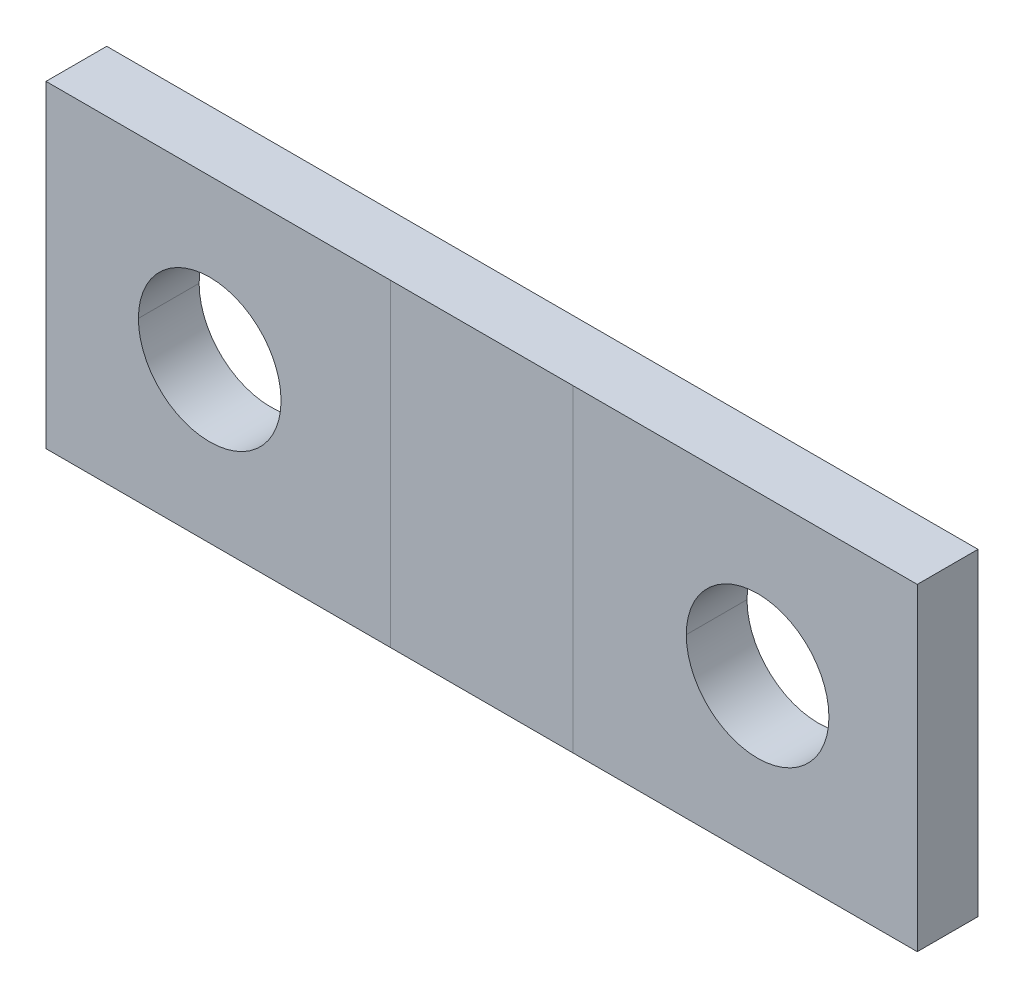
ISO-10303-21;
HEADER;
FILE_DESCRIPTION(('STEP AP214'),'2;1');
FILE_NAME('part.step','',(''),(''),'','','');
FILE_SCHEMA(('AUTOMOTIVE_DESIGN { 1 0 10303 214 1 1 1 1 }'));
ENDSEC;
DATA;
#1=APPLICATION_CONTEXT('core data for automotive mechanical design processes');
#2=APPLICATION_PROTOCOL_DEFINITION('international standard','automotive_design',2000,#1);
#3=PRODUCT_CONTEXT('',#1,'mechanical');
#4=PRODUCT('Part','Part','',(#3));
#5=PRODUCT_RELATED_PRODUCT_CATEGORY('part','',(#4));
#6=PRODUCT_DEFINITION_FORMATION('','',#4);
#7=PRODUCT_DEFINITION_CONTEXT('part definition',#1,'design');
#8=PRODUCT_DEFINITION('design','',#6,#7);
#9=PRODUCT_DEFINITION_SHAPE('','',#8);
#10=(LENGTH_UNIT() NAMED_UNIT(*) SI_UNIT(.MILLI.,.METRE.));
#11=(NAMED_UNIT(*) PLANE_ANGLE_UNIT() SI_UNIT($,.RADIAN.));
#12=(NAMED_UNIT(*) SI_UNIT($,.STERADIAN.) SOLID_ANGLE_UNIT());
#13=UNCERTAINTY_MEASURE_WITH_UNIT(LENGTH_MEASURE(1.E-05),#10,'distance_accuracy_value','');
#14=(GEOMETRIC_REPRESENTATION_CONTEXT(3) GLOBAL_UNCERTAINTY_ASSIGNED_CONTEXT((#13)) GLOBAL_UNIT_ASSIGNED_CONTEXT((#10,
#11,#12)) REPRESENTATION_CONTEXT('',''));
#15=CARTESIAN_POINT('',(0.,0.,0.));
#16=DIRECTION('',(0.,0.,1.));
#17=DIRECTION('',(1.,0.,0.));
#18=AXIS2_PLACEMENT_3D('',#15,#16,#17);
#19=CARTESIAN_POINT('',(-6.71,3.925,0.7486));
#20=DIRECTION('',(0.,0.,1.));
#21=DIRECTION('',(1.,0.,0.));
#22=AXIS2_PLACEMENT_3D('',#19,#20,#21);
#23=CYLINDRICAL_SURFACE('',#22,1.76);
#24=CARTESIAN_POINT('',(-6.71,3.925,-0.75));
#25=DIRECTION('',(0.,0.,1.));
#26=DIRECTION('',(1.,0.,0.));
#27=AXIS2_PLACEMENT_3D('',#24,#25,#26);
#28=CIRCLE('',#27,1.76);
#29=CARTESIAN_POINT('',(-8.47,3.925,-0.75));
#30=VERTEX_POINT('',#29);
#31=CARTESIAN_POINT('',(-4.95,3.925,-0.75));
#32=VERTEX_POINT('',#31);
#33=EDGE_CURVE('E42',#30,#32,#28,.T.);
#34=ORIENTED_EDGE('',*,*,#33,.F.);
#35=DIRECTION('',(0.,0.,1.));
#36=VECTOR('',#35,1.);
#37=CARTESIAN_POINT('',(-8.47,3.925,0.7486));
#38=LINE('',#37,#36);
#39=CARTESIAN_POINT('',(-8.47,3.925,0.7486));
#40=VERTEX_POINT('',#39);
#41=EDGE_CURVE('E11',#30,#40,#38,.T.);
#42=ORIENTED_EDGE('',*,*,#41,.T.);
#43=CARTESIAN_POINT('',(-6.71,3.925,0.7486));
#44=DIRECTION('',(0.,0.,1.));
#45=DIRECTION('',(1.,0.,0.));
#46=AXIS2_PLACEMENT_3D('',#43,#44,#45);
#47=CIRCLE('',#46,1.76);
#48=CARTESIAN_POINT('',(-4.95,3.925,0.7486));
#49=VERTEX_POINT('',#48);
#50=EDGE_CURVE('E28',#40,#49,#47,.T.);
#51=ORIENTED_EDGE('',*,*,#50,.T.);
#52=DIRECTION('',(0.,0.,1.));
#53=VECTOR('',#52,1.);
#54=CARTESIAN_POINT('',(-4.95,3.925,0.7486));
#55=LINE('',#54,#53);
#56=EDGE_CURVE('E115',#32,#49,#55,.T.);
#57=ORIENTED_EDGE('',*,*,#56,.F.);
#58=EDGE_LOOP('',(#34,#42,#51,#57));
#59=FACE_BOUND('',#58,.T.);
#60=ADVANCED_FACE('F17',(#59),#23,.F.);
#61=CARTESIAN_POINT('',(6.81,3.925,0.7486));
#62=DIRECTION('',(0.,0.,1.));
#63=DIRECTION('',(1.,0.,0.));
#64=AXIS2_PLACEMENT_3D('',#61,#62,#63);
#65=CYLINDRICAL_SURFACE('',#64,1.76);
#66=CARTESIAN_POINT('',(6.81,3.925,-0.75));
#67=DIRECTION('',(0.,0.,1.));
#68=DIRECTION('',(1.,0.,0.));
#69=AXIS2_PLACEMENT_3D('',#66,#67,#68);
#70=CIRCLE('',#69,1.76);
#71=CARTESIAN_POINT('',(5.05,3.925,-0.75));
#72=VERTEX_POINT('',#71);
#73=CARTESIAN_POINT('',(8.57,3.925,-0.75));
#74=VERTEX_POINT('',#73);
#75=EDGE_CURVE('E144',#72,#74,#70,.T.);
#76=ORIENTED_EDGE('',*,*,#75,.F.);
#77=DIRECTION('',(0.,0.,1.));
#78=VECTOR('',#77,1.);
#79=CARTESIAN_POINT('',(5.05,3.925,0.7486));
#80=LINE('',#79,#78);
#81=CARTESIAN_POINT('',(5.05,3.925,0.7486));
#82=VERTEX_POINT('',#81);
#83=EDGE_CURVE('E139',#72,#82,#80,.T.);
#84=ORIENTED_EDGE('',*,*,#83,.T.);
#85=CARTESIAN_POINT('',(6.81,3.925,0.7486));
#86=DIRECTION('',(0.,0.,1.));
#87=DIRECTION('',(1.,0.,0.));
#88=AXIS2_PLACEMENT_3D('',#85,#86,#87);
#89=CIRCLE('',#88,1.76);
#90=CARTESIAN_POINT('',(8.57,3.925,0.7486));
#91=VERTEX_POINT('',#90);
#92=EDGE_CURVE('E133',#82,#91,#89,.T.);
#93=ORIENTED_EDGE('',*,*,#92,.T.);
#94=DIRECTION('',(0.,0.,1.));
#95=VECTOR('',#94,1.);
#96=CARTESIAN_POINT('',(8.57,3.925,0.7486));
#97=LINE('',#96,#95);
#98=EDGE_CURVE('E97',#74,#91,#97,.T.);
#99=ORIENTED_EDGE('',*,*,#98,.F.);
#100=EDGE_LOOP('',(#76,#84,#93,#99));
#101=FACE_BOUND('',#100,.T.);
#102=ADVANCED_FACE('F143',(#101),#65,.F.);
#103=CARTESIAN_POINT('',(10.75,0.,0.7486));
#104=DIRECTION('',(0.,0.,-1.));
#105=DIRECTION('',(0.,-1.,0.));
#106=AXIS2_PLACEMENT_3D('',#103,#104,#105);
#107=PLANE('',#106);
#108=DIRECTION('',(0.,-1.,0.));
#109=VECTOR('',#108,1.);
#110=CARTESIAN_POINT('',(2.25,0.,0.7486));
#111=LINE('',#110,#109);
#112=CARTESIAN_POINT('',(2.25,7.85,0.7486));
#113=VERTEX_POINT('',#112);
#114=CARTESIAN_POINT('',(2.25,0.,0.7486));
#115=VERTEX_POINT('',#114);
#116=EDGE_CURVE('E83',#113,#115,#111,.T.);
#117=ORIENTED_EDGE('',*,*,#116,.F.);
#118=DIRECTION('',(-1.,0.,0.));
#119=VECTOR('',#118,1.);
#120=CARTESIAN_POINT('',(10.75,7.85,0.7486));
#121=LINE('',#120,#119);
#122=CARTESIAN_POINT('',(-2.25,7.85,0.7486));
#123=VERTEX_POINT('',#122);
#124=EDGE_CURVE('E140',#113,#123,#121,.T.);
#125=ORIENTED_EDGE('',*,*,#124,.T.);
#126=DIRECTION('',(0.,1.,0.));
#127=VECTOR('',#126,1.);
#128=CARTESIAN_POINT('',(-2.25,0.,0.7486));
#129=LINE('',#128,#127);
#130=CARTESIAN_POINT('',(-2.25,0.,0.7486));
#131=VERTEX_POINT('',#130);
#132=EDGE_CURVE('E199',#131,#123,#129,.T.);
#133=ORIENTED_EDGE('',*,*,#132,.F.);
#134=DIRECTION('',(-1.,0.,0.));
#135=VECTOR('',#134,1.);
#136=CARTESIAN_POINT('',(10.75,0.,0.7486));
#137=LINE('',#136,#135);
#138=EDGE_CURVE('E172',#115,#131,#137,.T.);
#139=ORIENTED_EDGE('',*,*,#138,.F.);
#140=EDGE_LOOP('',(#117,#125,#133,#139));
#141=FACE_BOUND('',#140,.T.);
#142=ADVANCED_FACE('F276',(#141),#107,.F.);
#143=CARTESIAN_POINT('',(10.75,0.,0.7486));
#144=DIRECTION('',(0.,0.,-1.));
#145=DIRECTION('',(0.,-1.,0.));
#146=AXIS2_PLACEMENT_3D('',#143,#144,#145);
#147=PLANE('',#146);
#148=DIRECTION('',(-1.,0.,0.));
#149=VECTOR('',#148,1.);
#150=CARTESIAN_POINT('',(10.75,7.85,0.7486));
#151=LINE('',#150,#149);
#152=CARTESIAN_POINT('',(10.75,7.85,0.7486));
#153=VERTEX_POINT('',#152);
#154=EDGE_CURVE('E189',#153,#113,#151,.T.);
#155=ORIENTED_EDGE('',*,*,#154,.T.);
#156=ORIENTED_EDGE('',*,*,#116,.T.);
#157=DIRECTION('',(-1.,0.,0.));
#158=VECTOR('',#157,1.);
#159=CARTESIAN_POINT('',(10.75,0.,0.7486));
#160=LINE('',#159,#158);
#161=CARTESIAN_POINT('',(10.75,0.,0.7486));
#162=VERTEX_POINT('',#161);
#163=EDGE_CURVE('E169',#162,#115,#160,.T.);
#164=ORIENTED_EDGE('',*,*,#163,.F.);
#165=DIRECTION('',(0.,-1.,0.));
#166=VECTOR('',#165,1.);
#167=CARTESIAN_POINT('',(10.75,0.,0.7486));
#168=LINE('',#167,#166);
#169=EDGE_CURVE('E244',#153,#162,#168,.T.);
#170=ORIENTED_EDGE('',*,*,#169,.F.);
#171=EDGE_LOOP('',(#155,#156,#164,#170));
#172=FACE_BOUND('',#171,.T.);
#173=CARTESIAN_POINT('',(6.81,3.925,0.7486));
#174=DIRECTION('',(0.,0.,1.));
#175=DIRECTION('',(1.,0.,0.));
#176=AXIS2_PLACEMENT_3D('',#173,#174,#175);
#177=CIRCLE('',#176,1.76);
#178=EDGE_CURVE('E137',#91,#82,#177,.T.);
#179=ORIENTED_EDGE('',*,*,#178,.F.);
#180=ORIENTED_EDGE('',*,*,#92,.F.);
#181=EDGE_LOOP('',(#179,#180));
#182=FACE_BOUND('',#181,.T.);
#183=ADVANCED_FACE('F135',(#172,#182),#147,.F.);
#184=CARTESIAN_POINT('',(10.75,0.,0.7486));
#185=DIRECTION('',(0.,0.,-1.));
#186=DIRECTION('',(0.,-1.,0.));
#187=AXIS2_PLACEMENT_3D('',#184,#185,#186);
#188=PLANE('',#187);
#189=DIRECTION('',(-1.,0.,0.));
#190=VECTOR('',#189,1.);
#191=CARTESIAN_POINT('',(10.75,0.,0.7486));
#192=LINE('',#191,#190);
#193=CARTESIAN_POINT('',(-10.75,0.,0.7486));
#194=VERTEX_POINT('',#193);
#195=EDGE_CURVE('E174',#131,#194,#192,.T.);
#196=ORIENTED_EDGE('',*,*,#195,.F.);
#197=ORIENTED_EDGE('',*,*,#132,.T.);
#198=DIRECTION('',(-1.,0.,0.));
#199=VECTOR('',#198,1.);
#200=CARTESIAN_POINT('',(10.75,7.85,0.7486));
#201=LINE('',#200,#199);
#202=CARTESIAN_POINT('',(-10.75,7.85,0.7486));
#203=VERTEX_POINT('',#202);
#204=EDGE_CURVE('E205',#123,#203,#201,.T.);
#205=ORIENTED_EDGE('',*,*,#204,.T.);
#206=DIRECTION('',(0.,-1.,0.));
#207=VECTOR('',#206,1.);
#208=CARTESIAN_POINT('',(-10.75,0.,0.7486));
#209=LINE('',#208,#207);
#210=EDGE_CURVE('E168',#203,#194,#209,.T.);
#211=ORIENTED_EDGE('',*,*,#210,.T.);
#212=EDGE_LOOP('',(#196,#197,#205,#211));
#213=FACE_BOUND('',#212,.T.);
#214=CARTESIAN_POINT('',(-6.71,3.925,0.7486));
#215=DIRECTION('',(0.,0.,1.));
#216=DIRECTION('',(1.,0.,0.));
#217=AXIS2_PLACEMENT_3D('',#214,#215,#216);
#218=CIRCLE('',#217,1.76);
#219=EDGE_CURVE('E21',#49,#40,#218,.T.);
#220=ORIENTED_EDGE('',*,*,#219,.F.);
#221=ORIENTED_EDGE('',*,*,#50,.F.);
#222=EDGE_LOOP('',(#220,#221));
#223=FACE_BOUND('',#222,.T.);
#224=ADVANCED_FACE('F274',(#213,#223),#188,.F.);
#225=CARTESIAN_POINT('',(10.75,0.,0.7486));
#226=DIRECTION('',(0.,1.,0.));
#227=DIRECTION('',(1.,0.,0.));
#228=AXIS2_PLACEMENT_3D('',#225,#226,#227);
#229=PLANE('',#228);
#230=DIRECTION('',(0.,0.,-1.));
#231=VECTOR('',#230,1.);
#232=CARTESIAN_POINT('',(-10.75,0.,0.7486));
#233=LINE('',#232,#231);
#234=CARTESIAN_POINT('',(-10.75,0.,-0.75));
#235=VERTEX_POINT('',#234);
#236=EDGE_CURVE('E165',#194,#235,#233,.T.);
#237=ORIENTED_EDGE('',*,*,#236,.T.);
#238=DIRECTION('',(-1.,0.,0.));
#239=VECTOR('',#238,1.);
#240=CARTESIAN_POINT('',(10.75,0.,-0.75));
#241=LINE('',#240,#239);
#242=CARTESIAN_POINT('',(10.75,0.,-0.75));
#243=VERTEX_POINT('',#242);
#244=EDGE_CURVE('E225',#243,#235,#241,.T.);
#245=ORIENTED_EDGE('',*,*,#244,.F.);
#246=DIRECTION('',(0.,0.,-1.));
#247=VECTOR('',#246,1.);
#248=CARTESIAN_POINT('',(10.75,0.,0.7486));
#249=LINE('',#248,#247);
#250=EDGE_CURVE('E221',#162,#243,#249,.T.);
#251=ORIENTED_EDGE('',*,*,#250,.F.);
#252=ORIENTED_EDGE('',*,*,#163,.T.);
#253=ORIENTED_EDGE('',*,*,#138,.T.);
#254=ORIENTED_EDGE('',*,*,#195,.T.);
#255=EDGE_LOOP('',(#237,#245,#251,#252,#253,#254));
#256=FACE_BOUND('',#255,.T.);
#257=ADVANCED_FACE('F278',(#256),#229,.F.);
#258=CARTESIAN_POINT('',(10.75,0.,-0.75));
#259=DIRECTION('',(0.,0.,1.));
#260=DIRECTION('',(1.,0.,0.));
#261=AXIS2_PLACEMENT_3D('',#258,#259,#260);
#262=PLANE('',#261);
#263=DIRECTION('',(0.,1.,0.));
#264=VECTOR('',#263,1.);
#265=CARTESIAN_POINT('',(-10.75,0.,-0.75));
#266=LINE('',#265,#264);
#267=CARTESIAN_POINT('',(-10.75,7.85,-0.75));
#268=VERTEX_POINT('',#267);
#269=EDGE_CURVE('E185',#235,#268,#266,.T.);
#270=ORIENTED_EDGE('',*,*,#269,.T.);
#271=DIRECTION('',(-1.,0.,0.));
#272=VECTOR('',#271,1.);
#273=CARTESIAN_POINT('',(10.75,7.85,-0.75));
#274=LINE('',#273,#272);
#275=CARTESIAN_POINT('',(10.75,7.85,-0.75));
#276=VERTEX_POINT('',#275);
#277=EDGE_CURVE('E242',#276,#268,#274,.T.);
#278=ORIENTED_EDGE('',*,*,#277,.F.);
#279=DIRECTION('',(0.,1.,0.));
#280=VECTOR('',#279,1.);
#281=CARTESIAN_POINT('',(10.75,0.,-0.75));
#282=LINE('',#281,#280);
#283=EDGE_CURVE('E188',#243,#276,#282,.T.);
#284=ORIENTED_EDGE('',*,*,#283,.F.);
#285=ORIENTED_EDGE('',*,*,#244,.T.);
#286=EDGE_LOOP('',(#270,#278,#284,#285));
#287=FACE_BOUND('',#286,.T.);
#288=CARTESIAN_POINT('',(-6.71,3.925,-0.75));
#289=DIRECTION('',(0.,0.,1.));
#290=DIRECTION('',(1.,0.,0.));
#291=AXIS2_PLACEMENT_3D('',#288,#289,#290);
#292=CIRCLE('',#291,1.76);
#293=EDGE_CURVE('E178',#32,#30,#292,.T.);
#294=ORIENTED_EDGE('',*,*,#293,.T.);
#295=ORIENTED_EDGE('',*,*,#33,.T.);
#296=EDGE_LOOP('',(#294,#295));
#297=FACE_BOUND('',#296,.T.);
#298=CARTESIAN_POINT('',(6.81,3.925,-0.75));
#299=DIRECTION('',(0.,0.,1.));
#300=DIRECTION('',(1.,0.,0.));
#301=AXIS2_PLACEMENT_3D('',#298,#299,#300);
#302=CIRCLE('',#301,1.76);
#303=EDGE_CURVE('E179',#74,#72,#302,.T.);
#304=ORIENTED_EDGE('',*,*,#303,.T.);
#305=ORIENTED_EDGE('',*,*,#75,.T.);
#306=EDGE_LOOP('',(#304,#305));
#307=FACE_BOUND('',#306,.T.);
#308=ADVANCED_FACE('F19',(#287,#297,#307),#262,.F.);
#309=CARTESIAN_POINT('',(10.75,7.85,0.7486));
#310=DIRECTION('',(0.,-1.,0.));
#311=DIRECTION('',(0.,0.,-1.));
#312=AXIS2_PLACEMENT_3D('',#309,#310,#311);
#313=PLANE('',#312);
#314=DIRECTION('',(0.,0.,1.));
#315=VECTOR('',#314,1.);
#316=CARTESIAN_POINT('',(-10.75,7.85,0.7486));
#317=LINE('',#316,#315);
#318=EDGE_CURVE('E251',#268,#203,#317,.T.);
#319=ORIENTED_EDGE('',*,*,#318,.T.);
#320=ORIENTED_EDGE('',*,*,#204,.F.);
#321=ORIENTED_EDGE('',*,*,#124,.F.);
#322=ORIENTED_EDGE('',*,*,#154,.F.);
#323=DIRECTION('',(0.,0.,1.));
#324=VECTOR('',#323,1.);
#325=CARTESIAN_POINT('',(10.75,7.85,0.7486));
#326=LINE('',#325,#324);
#327=EDGE_CURVE('E158',#276,#153,#326,.T.);
#328=ORIENTED_EDGE('',*,*,#327,.F.);
#329=ORIENTED_EDGE('',*,*,#277,.T.);
#330=EDGE_LOOP('',(#319,#320,#321,#322,#328,#329));
#331=FACE_BOUND('',#330,.T.);
#332=ADVANCED_FACE('F268',(#331),#313,.F.);
#333=CARTESIAN_POINT('',(10.75,0.,0.));
#334=DIRECTION('',(-1.,0.,0.));
#335=DIRECTION('',(0.,0.,1.));
#336=AXIS2_PLACEMENT_3D('',#333,#334,#335);
#337=PLANE('',#336);
#338=ORIENTED_EDGE('',*,*,#169,.T.);
#339=ORIENTED_EDGE('',*,*,#250,.T.);
#340=ORIENTED_EDGE('',*,*,#283,.T.);
#341=ORIENTED_EDGE('',*,*,#327,.T.);
#342=EDGE_LOOP('',(#338,#339,#340,#341));
#343=FACE_BOUND('',#342,.T.);
#344=ADVANCED_FACE('F284',(#343),#337,.F.);
#345=CARTESIAN_POINT('',(-10.75,0.,0.));
#346=DIRECTION('',(-1.,0.,0.));
#347=DIRECTION('',(0.,0.,1.));
#348=AXIS2_PLACEMENT_3D('',#345,#346,#347);
#349=PLANE('',#348);
#350=ORIENTED_EDGE('',*,*,#210,.F.);
#351=ORIENTED_EDGE('',*,*,#318,.F.);
#352=ORIENTED_EDGE('',*,*,#269,.F.);
#353=ORIENTED_EDGE('',*,*,#236,.F.);
#354=EDGE_LOOP('',(#350,#351,#352,#353));
#355=FACE_BOUND('',#354,.T.);
#356=ADVANCED_FACE('F273',(#355),#349,.T.);
#357=CARTESIAN_POINT('',(6.81,3.925,0.7486));
#358=DIRECTION('',(0.,0.,1.));
#359=DIRECTION('',(1.,0.,0.));
#360=AXIS2_PLACEMENT_3D('',#357,#358,#359);
#361=CYLINDRICAL_SURFACE('',#360,1.76);
#362=ORIENTED_EDGE('',*,*,#83,.F.);
#363=ORIENTED_EDGE('',*,*,#303,.F.);
#364=ORIENTED_EDGE('',*,*,#98,.T.);
#365=ORIENTED_EDGE('',*,*,#178,.T.);
#366=EDGE_LOOP('',(#362,#363,#364,#365));
#367=FACE_BOUND('',#366,.T.);
#368=ADVANCED_FACE('F150',(#367),#361,.F.);
#369=CARTESIAN_POINT('',(-6.71,3.925,0.7486));
#370=DIRECTION('',(0.,0.,1.));
#371=DIRECTION('',(1.,0.,0.));
#372=AXIS2_PLACEMENT_3D('',#369,#370,#371);
#373=CYLINDRICAL_SURFACE('',#372,1.76);
#374=ORIENTED_EDGE('',*,*,#41,.F.);
#375=ORIENTED_EDGE('',*,*,#293,.F.);
#376=ORIENTED_EDGE('',*,*,#56,.T.);
#377=ORIENTED_EDGE('',*,*,#219,.T.);
#378=EDGE_LOOP('',(#374,#375,#376,#377));
#379=FACE_BOUND('',#378,.T.);
#380=ADVANCED_FACE('F421',(#379),#373,.F.);
#381=CLOSED_SHELL('',(#60,#102,#142,#183,#224,#257,#308,#332,#344,#356,#368,#380));
#382=MANIFOLD_SOLID_BREP('B1',#381);
#383=ADVANCED_BREP_SHAPE_REPRESENTATION('',(#18,#382),#14);
#384=SHAPE_DEFINITION_REPRESENTATION(#9,#383);
ENDSEC;
END-ISO-10303-21;
